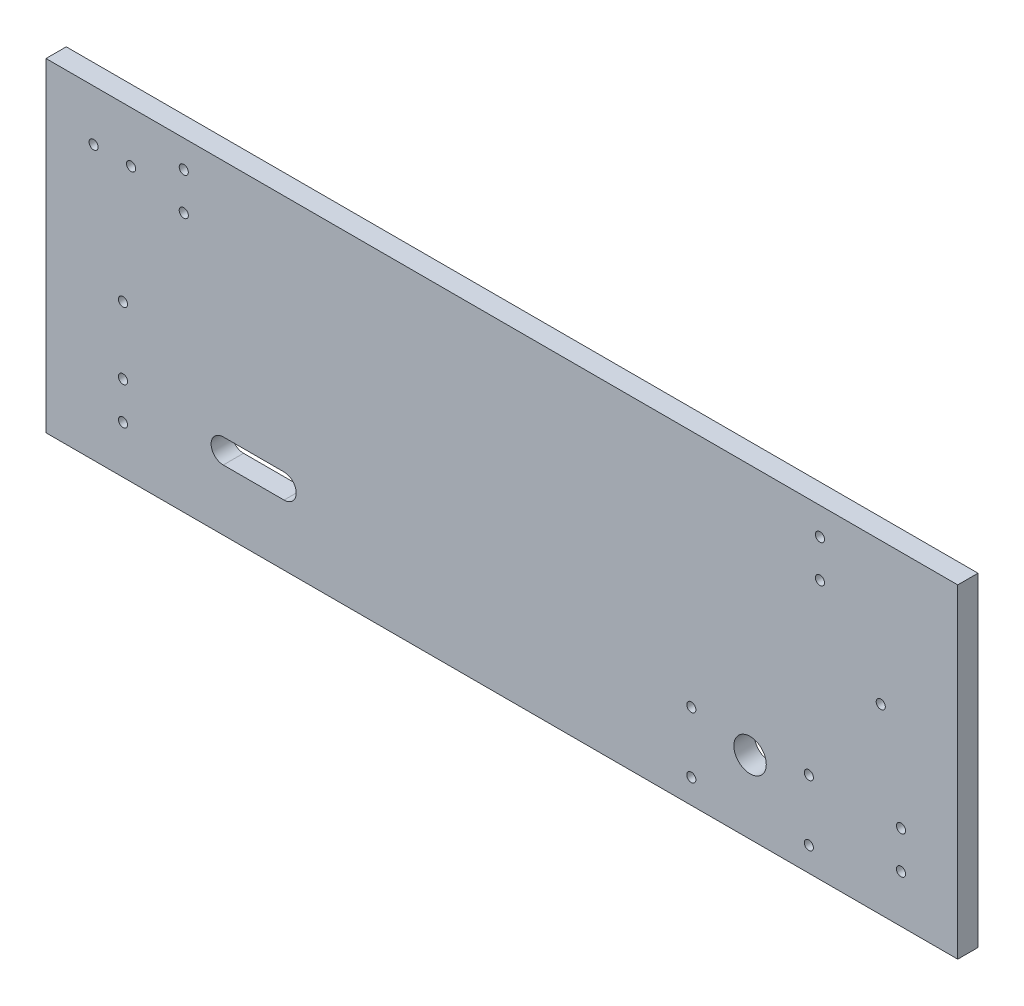
ISO-10303-21;
HEADER;
FILE_DESCRIPTION(('STEP AP214'),'2;1');
FILE_NAME('part.step','',(''),(''),'','','');
FILE_SCHEMA(('AUTOMOTIVE_DESIGN { 1 0 10303 214 1 1 1 1 }'));
ENDSEC;
DATA;
#1=APPLICATION_CONTEXT('core data for automotive mechanical design processes');
#2=APPLICATION_PROTOCOL_DEFINITION('international standard','automotive_design',2000,#1);
#3=PRODUCT_CONTEXT('',#1,'mechanical');
#4=PRODUCT('Part','Part','',(#3));
#5=PRODUCT_RELATED_PRODUCT_CATEGORY('part','',(#4));
#6=PRODUCT_DEFINITION_FORMATION('','',#4);
#7=PRODUCT_DEFINITION_CONTEXT('part definition',#1,'design');
#8=PRODUCT_DEFINITION('design','',#6,#7);
#9=PRODUCT_DEFINITION_SHAPE('','',#8);
#10=(LENGTH_UNIT() NAMED_UNIT(*) SI_UNIT(.MILLI.,.METRE.));
#11=(NAMED_UNIT(*) PLANE_ANGLE_UNIT() SI_UNIT($,.RADIAN.));
#12=(NAMED_UNIT(*) SI_UNIT($,.STERADIAN.) SOLID_ANGLE_UNIT());
#13=UNCERTAINTY_MEASURE_WITH_UNIT(LENGTH_MEASURE(1.E-05),#10,'distance_accuracy_value','');
#14=(GEOMETRIC_REPRESENTATION_CONTEXT(3) GLOBAL_UNCERTAINTY_ASSIGNED_CONTEXT((#13)) GLOBAL_UNIT_ASSIGNED_CONTEXT((#10,
#11,#12)) REPRESENTATION_CONTEXT('',''));
#15=CARTESIAN_POINT('',(0.,0.,0.));
#16=DIRECTION('',(0.,0.,1.));
#17=DIRECTION('',(1.,0.,0.));
#18=AXIS2_PLACEMENT_3D('',#15,#16,#17);
#19=CARTESIAN_POINT('',(0.,0.,10.));
#20=DIRECTION('',(1.,0.,0.));
#21=DIRECTION('',(0.,0.,-1.));
#22=AXIS2_PLACEMENT_3D('',#19,#20,#21);
#23=PLANE('',#22);
#24=DIRECTION('',(0.,-1.,0.));
#25=VECTOR('',#24,1.);
#26=CARTESIAN_POINT('',(0.,0.,0.));
#27=LINE('',#26,#25);
#28=CARTESIAN_POINT('',(0.,160.,0.));
#29=VERTEX_POINT('',#28);
#30=CARTESIAN_POINT('',(0.,0.,0.));
#31=VERTEX_POINT('',#30);
#32=EDGE_CURVE('E146',#29,#31,#27,.T.);
#33=ORIENTED_EDGE('',*,*,#32,.T.);
#34=DIRECTION('',(0.,0.,-1.));
#35=VECTOR('',#34,1.);
#36=CARTESIAN_POINT('',(0.,0.,10.));
#37=LINE('',#36,#35);
#38=CARTESIAN_POINT('',(0.,0.,10.));
#39=VERTEX_POINT('',#38);
#40=EDGE_CURVE('E11',#39,#31,#37,.T.);
#41=ORIENTED_EDGE('',*,*,#40,.F.);
#42=DIRECTION('',(0.,-1.,0.));
#43=VECTOR('',#42,1.);
#44=CARTESIAN_POINT('',(0.,0.,10.));
#45=LINE('',#44,#43);
#46=CARTESIAN_POINT('',(0.,160.,10.));
#47=VERTEX_POINT('',#46);
#48=EDGE_CURVE('E148',#47,#39,#45,.T.);
#49=ORIENTED_EDGE('',*,*,#48,.F.);
#50=DIRECTION('',(0.,0.,-1.));
#51=VECTOR('',#50,1.);
#52=CARTESIAN_POINT('',(0.,160.,10.));
#53=LINE('',#52,#51);
#54=EDGE_CURVE('E158',#47,#29,#53,.T.);
#55=ORIENTED_EDGE('',*,*,#54,.T.);
#56=EDGE_LOOP('',(#33,#41,#49,#55));
#57=FACE_BOUND('',#56,.T.);
#58=ADVANCED_FACE('F37',(#57),#23,.F.);
#59=CARTESIAN_POINT('',(0.,0.,10.));
#60=DIRECTION('',(0.,1.,0.));
#61=DIRECTION('',(0.,0.,1.));
#62=AXIS2_PLACEMENT_3D('',#59,#60,#61);
#63=PLANE('',#62);
#64=DIRECTION('',(1.,0.,0.));
#65=VECTOR('',#64,1.);
#66=CARTESIAN_POINT('',(0.,0.,0.));
#67=LINE('',#66,#65);
#68=CARTESIAN_POINT('',(450.,0.,0.));
#69=VERTEX_POINT('',#68);
#70=EDGE_CURVE('E161',#31,#69,#67,.T.);
#71=ORIENTED_EDGE('',*,*,#70,.T.);
#72=DIRECTION('',(0.,0.,-1.));
#73=VECTOR('',#72,1.);
#74=CARTESIAN_POINT('',(450.,0.,10.));
#75=LINE('',#74,#73);
#76=CARTESIAN_POINT('',(450.,0.,10.));
#77=VERTEX_POINT('',#76);
#78=EDGE_CURVE('E44',#77,#69,#75,.T.);
#79=ORIENTED_EDGE('',*,*,#78,.F.);
#80=DIRECTION('',(1.,0.,0.));
#81=VECTOR('',#80,1.);
#82=CARTESIAN_POINT('',(0.,0.,10.));
#83=LINE('',#82,#81);
#84=EDGE_CURVE('E151',#39,#77,#83,.T.);
#85=ORIENTED_EDGE('',*,*,#84,.F.);
#86=ORIENTED_EDGE('',*,*,#40,.T.);
#87=EDGE_LOOP('',(#71,#79,#85,#86));
#88=FACE_BOUND('',#87,.T.);
#89=ADVANCED_FACE('F190',(#88),#63,.F.);
#90=CARTESIAN_POINT('',(450.,0.,10.));
#91=DIRECTION('',(-1.,0.,0.));
#92=DIRECTION('',(0.,0.,1.));
#93=AXIS2_PLACEMENT_3D('',#90,#91,#92);
#94=PLANE('',#93);
#95=DIRECTION('',(0.,1.,0.));
#96=VECTOR('',#95,1.);
#97=CARTESIAN_POINT('',(450.,0.,0.));
#98=LINE('',#97,#96);
#99=CARTESIAN_POINT('',(450.,160.,0.));
#100=VERTEX_POINT('',#99);
#101=EDGE_CURVE('E163',#69,#100,#98,.T.);
#102=ORIENTED_EDGE('',*,*,#101,.T.);
#103=DIRECTION('',(0.,0.,-1.));
#104=VECTOR('',#103,1.);
#105=CARTESIAN_POINT('',(450.,160.,10.));
#106=LINE('',#105,#104);
#107=CARTESIAN_POINT('',(450.,160.,10.));
#108=VERTEX_POINT('',#107);
#109=EDGE_CURVE('E168',#108,#100,#106,.T.);
#110=ORIENTED_EDGE('',*,*,#109,.F.);
#111=DIRECTION('',(0.,1.,0.));
#112=VECTOR('',#111,1.);
#113=CARTESIAN_POINT('',(450.,0.,10.));
#114=LINE('',#113,#112);
#115=EDGE_CURVE('E154',#77,#108,#114,.T.);
#116=ORIENTED_EDGE('',*,*,#115,.F.);
#117=ORIENTED_EDGE('',*,*,#78,.T.);
#118=EDGE_LOOP('',(#102,#110,#116,#117));
#119=FACE_BOUND('',#118,.T.);
#120=ADVANCED_FACE('F175',(#119),#94,.F.);
#121=CARTESIAN_POINT('',(0.,160.,10.));
#122=DIRECTION('',(0.,-1.,0.));
#123=DIRECTION('',(0.,0.,-1.));
#124=AXIS2_PLACEMENT_3D('',#121,#122,#123);
#125=PLANE('',#124);
#126=DIRECTION('',(-1.,0.,0.));
#127=VECTOR('',#126,1.);
#128=CARTESIAN_POINT('',(0.,160.,0.));
#129=LINE('',#128,#127);
#130=EDGE_CURVE('E152',#100,#29,#129,.T.);
#131=ORIENTED_EDGE('',*,*,#130,.T.);
#132=ORIENTED_EDGE('',*,*,#54,.F.);
#133=DIRECTION('',(-1.,0.,0.));
#134=VECTOR('',#133,1.);
#135=CARTESIAN_POINT('',(0.,160.,10.));
#136=LINE('',#135,#134);
#137=EDGE_CURVE('E156',#108,#47,#136,.T.);
#138=ORIENTED_EDGE('',*,*,#137,.F.);
#139=ORIENTED_EDGE('',*,*,#109,.T.);
#140=EDGE_LOOP('',(#131,#132,#138,#139));
#141=FACE_BOUND('',#140,.T.);
#142=ADVANCED_FACE('F184',(#141),#125,.F.);
#143=CARTESIAN_POINT('',(0.,0.,10.));
#144=DIRECTION('',(0.,0.,-1.));
#145=DIRECTION('',(-1.,0.,0.));
#146=AXIS2_PLACEMENT_3D('',#143,#144,#145);
#147=PLANE('',#146);
#148=CARTESIAN_POINT('',(68.0000000000001,146.5,10.));
#149=DIRECTION('',(0.,0.,1.));
#150=DIRECTION('',(1.,0.,0.));
#151=AXIS2_PLACEMENT_3D('',#148,#149,#150);
#152=CIRCLE('',#151,2.25);
#153=CARTESIAN_POINT('',(70.2500000000001,146.5,10.));
#154=VERTEX_POINT('',#153);
#155=EDGE_CURVE('E329',#154,#154,#152,.T.);
#156=ORIENTED_EDGE('',*,*,#155,.F.);
#157=EDGE_LOOP('',(#156));
#158=FACE_BOUND('',#157,.T.);
#159=CARTESIAN_POINT('',(382.,128.,10.));
#160=DIRECTION('',(0.,0.,1.));
#161=DIRECTION('',(1.,0.,0.));
#162=AXIS2_PLACEMENT_3D('',#159,#160,#161);
#163=CIRCLE('',#162,2.24999999999996);
#164=CARTESIAN_POINT('',(384.25,128.,10.));
#165=VERTEX_POINT('',#164);
#166=EDGE_CURVE('E322',#165,#165,#163,.T.);
#167=ORIENTED_EDGE('',*,*,#166,.F.);
#168=EDGE_LOOP('',(#167));
#169=FACE_BOUND('',#168,.T.);
#170=CARTESIAN_POINT('',(382.,146.5,10.));
#171=DIRECTION('',(0.,0.,1.));
#172=DIRECTION('',(1.,0.,0.));
#173=AXIS2_PLACEMENT_3D('',#170,#171,#172);
#174=CIRCLE('',#173,2.24999999999996);
#175=CARTESIAN_POINT('',(384.25,146.5,10.));
#176=VERTEX_POINT('',#175);
#177=EDGE_CURVE('E341',#176,#176,#174,.T.);
#178=ORIENTED_EDGE('',*,*,#177,.F.);
#179=EDGE_LOOP('',(#178));
#180=FACE_BOUND('',#179,.T.);
#181=CARTESIAN_POINT('',(412.,89.9999999999999,10.));
#182=DIRECTION('',(0.,0.,1.));
#183=DIRECTION('',(1.,0.,0.));
#184=AXIS2_PLACEMENT_3D('',#181,#182,#183);
#185=CIRCLE('',#184,2.24999999999995);
#186=CARTESIAN_POINT('',(414.25,89.9999999999999,10.));
#187=VERTEX_POINT('',#186);
#188=EDGE_CURVE('E334',#187,#187,#185,.T.);
#189=ORIENTED_EDGE('',*,*,#188,.F.);
#190=EDGE_LOOP('',(#189));
#191=FACE_BOUND('',#190,.T.);
#192=CARTESIAN_POINT('',(68.0000000000001,128.,10.));
#193=DIRECTION('',(0.,0.,1.));
#194=DIRECTION('',(1.,0.,0.));
#195=AXIS2_PLACEMENT_3D('',#192,#193,#194);
#196=CIRCLE('',#195,2.25);
#197=CARTESIAN_POINT('',(70.2500000000001,128.,10.));
#198=VERTEX_POINT('',#197);
#199=EDGE_CURVE('E301',#198,#198,#196,.T.);
#200=ORIENTED_EDGE('',*,*,#199,.F.);
#201=EDGE_LOOP('',(#200));
#202=FACE_BOUND('',#201,.T.);
#203=CARTESIAN_POINT('',(38.,42.,10.));
#204=DIRECTION('',(0.,0.,1.));
#205=DIRECTION('',(1.,0.,0.));
#206=AXIS2_PLACEMENT_3D('',#203,#204,#205);
#207=CIRCLE('',#206,2.25);
#208=CARTESIAN_POINT('',(40.25,42.,10.));
#209=VERTEX_POINT('',#208);
#210=EDGE_CURVE('E308',#209,#209,#207,.T.);
#211=ORIENTED_EDGE('',*,*,#210,.F.);
#212=EDGE_LOOP('',(#211));
#213=FACE_BOUND('',#212,.T.);
#214=CARTESIAN_POINT('',(38.,23.5,10.));
#215=DIRECTION('',(0.,0.,1.));
#216=DIRECTION('',(1.,0.,0.));
#217=AXIS2_PLACEMENT_3D('',#214,#215,#216);
#218=CIRCLE('',#217,2.25);
#219=CARTESIAN_POINT('',(40.25,23.5,10.));
#220=VERTEX_POINT('',#219);
#221=EDGE_CURVE('E314',#220,#220,#218,.T.);
#222=ORIENTED_EDGE('',*,*,#221,.F.);
#223=EDGE_LOOP('',(#222));
#224=FACE_BOUND('',#223,.T.);
#225=CARTESIAN_POINT('',(422.,23.4999999999999,10.));
#226=DIRECTION('',(0.,0.,1.));
#227=DIRECTION('',(1.,0.,0.));
#228=AXIS2_PLACEMENT_3D('',#225,#226,#227);
#229=CIRCLE('',#228,2.24999999999995);
#230=CARTESIAN_POINT('',(424.25,23.4999999999999,10.));
#231=VERTEX_POINT('',#230);
#232=EDGE_CURVE('E297',#231,#231,#229,.T.);
#233=ORIENTED_EDGE('',*,*,#232,.F.);
#234=EDGE_LOOP('',(#233));
#235=FACE_BOUND('',#234,.T.);
#236=CARTESIAN_POINT('',(318.5,12.,10.));
#237=DIRECTION('',(0.,0.,1.));
#238=DIRECTION('',(1.,0.,0.));
#239=AXIS2_PLACEMENT_3D('',#236,#237,#238);
#240=CIRCLE('',#239,2.24999999999995);
#241=CARTESIAN_POINT('',(320.75,12.,10.));
#242=VERTEX_POINT('',#241);
#243=EDGE_CURVE('E375',#242,#242,#240,.T.);
#244=ORIENTED_EDGE('',*,*,#243,.F.);
#245=EDGE_LOOP('',(#244));
#246=FACE_BOUND('',#245,.T.);
#247=CARTESIAN_POINT('',(318.5,42.,10.));
#248=DIRECTION('',(0.,0.,1.));
#249=DIRECTION('',(1.,0.,0.));
#250=AXIS2_PLACEMENT_3D('',#247,#248,#249);
#251=CIRCLE('',#250,2.24999999999995);
#252=CARTESIAN_POINT('',(320.75,42.,10.));
#253=VERTEX_POINT('',#252);
#254=EDGE_CURVE('E144',#253,#253,#251,.T.);
#255=ORIENTED_EDGE('',*,*,#254,.F.);
#256=EDGE_LOOP('',(#255));
#257=FACE_BOUND('',#256,.T.);
#258=CARTESIAN_POINT('',(376.5,42.,10.));
#259=DIRECTION('',(0.,0.,1.));
#260=DIRECTION('',(1.,0.,0.));
#261=AXIS2_PLACEMENT_3D('',#258,#259,#260);
#262=CIRCLE('',#261,2.24999999999995);
#263=CARTESIAN_POINT('',(378.75,42.,10.));
#264=VERTEX_POINT('',#263);
#265=EDGE_CURVE('E108',#264,#264,#262,.T.);
#266=ORIENTED_EDGE('',*,*,#265,.F.);
#267=EDGE_LOOP('',(#266));
#268=FACE_BOUND('',#267,.T.);
#269=DIRECTION('',(1.,0.,0.));
#270=VECTOR('',#269,1.);
#271=CARTESIAN_POINT('',(87.5,30.,10.));
#272=LINE('',#271,#270);
#273=CARTESIAN_POINT('',(87.5,30.,10.));
#274=VERTEX_POINT('',#273);
#275=CARTESIAN_POINT('',(117.5,30.,10.));
#276=VERTEX_POINT('',#275);
#277=EDGE_CURVE('E122',#274,#276,#272,.T.);
#278=ORIENTED_EDGE('',*,*,#277,.F.);
#279=CARTESIAN_POINT('',(87.5,36.,10.));
#280=DIRECTION('',(0.,0.,1.));
#281=DIRECTION('',(1.,0.,0.));
#282=AXIS2_PLACEMENT_3D('',#279,#280,#281);
#283=CIRCLE('',#282,6.);
#284=CARTESIAN_POINT('',(87.5,42.,10.));
#285=VERTEX_POINT('',#284);
#286=EDGE_CURVE('E51',#285,#274,#283,.T.);
#287=ORIENTED_EDGE('',*,*,#286,.F.);
#288=DIRECTION('',(-1.,0.,0.));
#289=VECTOR('',#288,1.);
#290=CARTESIAN_POINT('',(87.5,42.,10.));
#291=LINE('',#290,#289);
#292=CARTESIAN_POINT('',(117.5,42.,10.));
#293=VERTEX_POINT('',#292);
#294=EDGE_CURVE('E111',#293,#285,#291,.T.);
#295=ORIENTED_EDGE('',*,*,#294,.F.);
#296=CARTESIAN_POINT('',(117.5,36.,10.));
#297=DIRECTION('',(0.,0.,1.));
#298=DIRECTION('',(1.,0.,0.));
#299=AXIS2_PLACEMENT_3D('',#296,#297,#298);
#300=CIRCLE('',#299,6.);
#301=EDGE_CURVE('E116',#276,#293,#300,.T.);
#302=ORIENTED_EDGE('',*,*,#301,.F.);
#303=EDGE_LOOP('',(#278,#287,#295,#302));
#304=FACE_BOUND('',#303,.T.);
#305=CARTESIAN_POINT('',(38.,75.,10.));
#306=DIRECTION('',(0.,0.,1.));
#307=DIRECTION('',(1.,0.,0.));
#308=AXIS2_PLACEMENT_3D('',#305,#306,#307);
#309=CIRCLE('',#308,2.25);
#310=CARTESIAN_POINT('',(40.25,75.,10.));
#311=VERTEX_POINT('',#310);
#312=EDGE_CURVE('E353',#311,#311,#309,.T.);
#313=ORIENTED_EDGE('',*,*,#312,.F.);
#314=EDGE_LOOP('',(#313));
#315=FACE_BOUND('',#314,.T.);
#316=CARTESIAN_POINT('',(42.,134.933694221876,10.));
#317=DIRECTION('',(0.,0.,1.));
#318=DIRECTION('',(1.,0.,0.));
#319=AXIS2_PLACEMENT_3D('',#316,#317,#318);
#320=CIRCLE('',#319,2.25);
#321=CARTESIAN_POINT('',(44.25,134.933694221876,10.));
#322=VERTEX_POINT('',#321);
#323=EDGE_CURVE('E346',#322,#322,#320,.T.);
#324=ORIENTED_EDGE('',*,*,#323,.F.);
#325=EDGE_LOOP('',(#324));
#326=FACE_BOUND('',#325,.T.);
#327=CARTESIAN_POINT('',(23.5,134.933694221876,10.));
#328=DIRECTION('',(0.,0.,1.));
#329=DIRECTION('',(1.,0.,0.));
#330=AXIS2_PLACEMENT_3D('',#327,#328,#329);
#331=CIRCLE('',#330,2.25);
#332=CARTESIAN_POINT('',(25.75,134.933694221876,10.));
#333=VERTEX_POINT('',#332);
#334=EDGE_CURVE('E365',#333,#333,#331,.T.);
#335=ORIENTED_EDGE('',*,*,#334,.F.);
#336=EDGE_LOOP('',(#335));
#337=FACE_BOUND('',#336,.T.);
#338=CARTESIAN_POINT('',(376.5,12.,10.));
#339=DIRECTION('',(0.,0.,1.));
#340=DIRECTION('',(1.,0.,0.));
#341=AXIS2_PLACEMENT_3D('',#338,#339,#340);
#342=CIRCLE('',#341,2.25000000000001);
#343=CARTESIAN_POINT('',(378.75,12.,10.));
#344=VERTEX_POINT('',#343);
#345=EDGE_CURVE('E358',#344,#344,#342,.T.);
#346=ORIENTED_EDGE('',*,*,#345,.F.);
#347=EDGE_LOOP('',(#346));
#348=FACE_BOUND('',#347,.T.);
#349=CARTESIAN_POINT('',(422.,41.9999999999999,10.));
#350=DIRECTION('',(0.,0.,1.));
#351=DIRECTION('',(1.,0.,0.));
#352=AXIS2_PLACEMENT_3D('',#349,#350,#351);
#353=CIRCLE('',#352,2.24999999999995);
#354=CARTESIAN_POINT('',(424.25,41.9999999999999,10.));
#355=VERTEX_POINT('',#354);
#356=EDGE_CURVE('E292',#355,#355,#353,.T.);
#357=ORIENTED_EDGE('',*,*,#356,.F.);
#358=EDGE_LOOP('',(#357));
#359=FACE_BOUND('',#358,.T.);
#360=CARTESIAN_POINT('',(347.5,36.,10.));
#361=DIRECTION('',(0.,0.,1.));
#362=DIRECTION('',(1.,0.,0.));
#363=AXIS2_PLACEMENT_3D('',#360,#361,#362);
#364=CIRCLE('',#363,7.99999999999998);
#365=CARTESIAN_POINT('',(355.5,36.,10.));
#366=VERTEX_POINT('',#365);
#367=EDGE_CURVE('E123',#366,#366,#364,.T.);
#368=ORIENTED_EDGE('',*,*,#367,.F.);
#369=EDGE_LOOP('',(#368));
#370=FACE_BOUND('',#369,.T.);
#371=ORIENTED_EDGE('',*,*,#48,.T.);
#372=ORIENTED_EDGE('',*,*,#84,.T.);
#373=ORIENTED_EDGE('',*,*,#115,.T.);
#374=ORIENTED_EDGE('',*,*,#137,.T.);
#375=EDGE_LOOP('',(#371,#372,#373,#374));
#376=FACE_BOUND('',#375,.T.);
#377=ADVANCED_FACE('F119',(#158,#169,#180,#191,#202,#213,#224,#235,#246,#257,#268,#304,#315,
#326,#337,#348,#359,#370,#376),#147,.F.);
#378=CARTESIAN_POINT('',(0.,0.,0.));
#379=DIRECTION('',(0.,0.,-1.));
#380=DIRECTION('',(-1.,0.,0.));
#381=AXIS2_PLACEMENT_3D('',#378,#379,#380);
#382=PLANE('',#381);
#383=CARTESIAN_POINT('',(68.0000000000001,146.5,0.));
#384=DIRECTION('',(0.,0.,1.));
#385=DIRECTION('',(1.,0.,0.));
#386=AXIS2_PLACEMENT_3D('',#383,#384,#385);
#387=CIRCLE('',#386,2.25);
#388=CARTESIAN_POINT('',(70.2500000000001,146.5,0.));
#389=VERTEX_POINT('',#388);
#390=EDGE_CURVE('E304',#389,#389,#387,.T.);
#391=ORIENTED_EDGE('',*,*,#390,.T.);
#392=EDGE_LOOP('',(#391));
#393=FACE_BOUND('',#392,.T.);
#394=CARTESIAN_POINT('',(382.,128.,0.));
#395=DIRECTION('',(0.,0.,1.));
#396=DIRECTION('',(1.,0.,0.));
#397=AXIS2_PLACEMENT_3D('',#394,#395,#396);
#398=CIRCLE('',#397,2.24999999999996);
#399=CARTESIAN_POINT('',(384.25,128.,0.));
#400=VERTEX_POINT('',#399);
#401=EDGE_CURVE('E326',#400,#400,#398,.T.);
#402=ORIENTED_EDGE('',*,*,#401,.T.);
#403=EDGE_LOOP('',(#402));
#404=FACE_BOUND('',#403,.T.);
#405=CARTESIAN_POINT('',(382.,146.5,0.));
#406=DIRECTION('',(0.,0.,1.));
#407=DIRECTION('',(1.,0.,0.));
#408=AXIS2_PLACEMENT_3D('',#405,#406,#407);
#409=CIRCLE('',#408,2.24999999999996);
#410=CARTESIAN_POINT('',(384.25,146.5,0.));
#411=VERTEX_POINT('',#410);
#412=EDGE_CURVE('E325',#411,#411,#409,.T.);
#413=ORIENTED_EDGE('',*,*,#412,.T.);
#414=EDGE_LOOP('',(#413));
#415=FACE_BOUND('',#414,.T.);
#416=CARTESIAN_POINT('',(412.,89.9999999999999,0.));
#417=DIRECTION('',(0.,0.,1.));
#418=DIRECTION('',(1.,0.,0.));
#419=AXIS2_PLACEMENT_3D('',#416,#417,#418);
#420=CIRCLE('',#419,2.24999999999995);
#421=CARTESIAN_POINT('',(414.25,89.9999999999999,0.));
#422=VERTEX_POINT('',#421);
#423=EDGE_CURVE('E338',#422,#422,#420,.T.);
#424=ORIENTED_EDGE('',*,*,#423,.T.);
#425=EDGE_LOOP('',(#424));
#426=FACE_BOUND('',#425,.T.);
#427=CARTESIAN_POINT('',(68.0000000000001,128.,0.));
#428=DIRECTION('',(0.,0.,1.));
#429=DIRECTION('',(1.,0.,0.));
#430=AXIS2_PLACEMENT_3D('',#427,#428,#429);
#431=CIRCLE('',#430,2.25);
#432=CARTESIAN_POINT('',(70.2500000000001,128.,0.));
#433=VERTEX_POINT('',#432);
#434=EDGE_CURVE('E305',#433,#433,#431,.T.);
#435=ORIENTED_EDGE('',*,*,#434,.T.);
#436=EDGE_LOOP('',(#435));
#437=FACE_BOUND('',#436,.T.);
#438=CARTESIAN_POINT('',(38.,42.,0.));
#439=DIRECTION('',(0.,0.,1.));
#440=DIRECTION('',(1.,0.,0.));
#441=AXIS2_PLACEMENT_3D('',#438,#439,#440);
#442=CIRCLE('',#441,2.25);
#443=CARTESIAN_POINT('',(40.25,42.,0.));
#444=VERTEX_POINT('',#443);
#445=EDGE_CURVE('E311',#444,#444,#442,.T.);
#446=ORIENTED_EDGE('',*,*,#445,.T.);
#447=EDGE_LOOP('',(#446));
#448=FACE_BOUND('',#447,.T.);
#449=CARTESIAN_POINT('',(38.,23.5,0.));
#450=DIRECTION('',(0.,0.,1.));
#451=DIRECTION('',(1.,0.,0.));
#452=AXIS2_PLACEMENT_3D('',#449,#450,#451);
#453=CIRCLE('',#452,2.25);
#454=CARTESIAN_POINT('',(40.25,23.5,0.));
#455=VERTEX_POINT('',#454);
#456=EDGE_CURVE('E317',#455,#455,#453,.T.);
#457=ORIENTED_EDGE('',*,*,#456,.T.);
#458=EDGE_LOOP('',(#457));
#459=FACE_BOUND('',#458,.T.);
#460=CARTESIAN_POINT('',(422.,23.4999999999999,0.));
#461=DIRECTION('',(0.,0.,1.));
#462=DIRECTION('',(1.,0.,0.));
#463=AXIS2_PLACEMENT_3D('',#460,#461,#462);
#464=CIRCLE('',#463,2.24999999999995);
#465=CARTESIAN_POINT('',(424.25,23.4999999999999,0.));
#466=VERTEX_POINT('',#465);
#467=EDGE_CURVE('E294',#466,#466,#464,.T.);
#468=ORIENTED_EDGE('',*,*,#467,.T.);
#469=EDGE_LOOP('',(#468));
#470=FACE_BOUND('',#469,.T.);
#471=CARTESIAN_POINT('',(318.5,12.,0.));
#472=DIRECTION('',(0.,0.,1.));
#473=DIRECTION('',(1.,0.,0.));
#474=AXIS2_PLACEMENT_3D('',#471,#472,#473);
#475=CIRCLE('',#474,2.24999999999995);
#476=CARTESIAN_POINT('',(320.75,12.,0.));
#477=VERTEX_POINT('',#476);
#478=EDGE_CURVE('E361',#477,#477,#475,.T.);
#479=ORIENTED_EDGE('',*,*,#478,.T.);
#480=EDGE_LOOP('',(#479));
#481=FACE_BOUND('',#480,.T.);
#482=CARTESIAN_POINT('',(318.5,42.,0.));
#483=DIRECTION('',(0.,0.,1.));
#484=DIRECTION('',(1.,0.,0.));
#485=AXIS2_PLACEMENT_3D('',#482,#483,#484);
#486=CIRCLE('',#485,2.24999999999995);
#487=CARTESIAN_POINT('',(320.75,42.,0.));
#488=VERTEX_POINT('',#487);
#489=EDGE_CURVE('E372',#488,#488,#486,.T.);
#490=ORIENTED_EDGE('',*,*,#489,.T.);
#491=EDGE_LOOP('',(#490));
#492=FACE_BOUND('',#491,.T.);
#493=CARTESIAN_POINT('',(376.5,42.,0.));
#494=DIRECTION('',(0.,0.,1.));
#495=DIRECTION('',(1.,0.,0.));
#496=AXIS2_PLACEMENT_3D('',#493,#494,#495);
#497=CIRCLE('',#496,2.24999999999995);
#498=CARTESIAN_POINT('',(378.75,42.,0.));
#499=VERTEX_POINT('',#498);
#500=EDGE_CURVE('E141',#499,#499,#497,.T.);
#501=ORIENTED_EDGE('',*,*,#500,.T.);
#502=EDGE_LOOP('',(#501));
#503=FACE_BOUND('',#502,.T.);
#504=CARTESIAN_POINT('',(87.5,36.,0.));
#505=DIRECTION('',(0.,0.,1.));
#506=DIRECTION('',(1.,0.,0.));
#507=AXIS2_PLACEMENT_3D('',#504,#505,#506);
#508=CIRCLE('',#507,6.);
#509=CARTESIAN_POINT('',(87.5,42.,0.));
#510=VERTEX_POINT('',#509);
#511=CARTESIAN_POINT('',(87.5,30.,0.));
#512=VERTEX_POINT('',#511);
#513=EDGE_CURVE('E103',#510,#512,#508,.T.);
#514=ORIENTED_EDGE('',*,*,#513,.T.);
#515=DIRECTION('',(1.,0.,0.));
#516=VECTOR('',#515,1.);
#517=CARTESIAN_POINT('',(87.5,30.,0.));
#518=LINE('',#517,#516);
#519=CARTESIAN_POINT('',(117.5,30.,0.));
#520=VERTEX_POINT('',#519);
#521=EDGE_CURVE('E135',#512,#520,#518,.T.);
#522=ORIENTED_EDGE('',*,*,#521,.T.);
#523=CARTESIAN_POINT('',(117.5,36.,0.));
#524=DIRECTION('',(0.,0.,1.));
#525=DIRECTION('',(1.,0.,0.));
#526=AXIS2_PLACEMENT_3D('',#523,#524,#525);
#527=CIRCLE('',#526,6.);
#528=CARTESIAN_POINT('',(117.5,42.,0.));
#529=VERTEX_POINT('',#528);
#530=EDGE_CURVE('E59',#520,#529,#527,.T.);
#531=ORIENTED_EDGE('',*,*,#530,.T.);
#532=DIRECTION('',(-1.,0.,0.));
#533=VECTOR('',#532,1.);
#534=CARTESIAN_POINT('',(87.5,42.,0.));
#535=LINE('',#534,#533);
#536=EDGE_CURVE('E131',#529,#510,#535,.T.);
#537=ORIENTED_EDGE('',*,*,#536,.T.);
#538=EDGE_LOOP('',(#514,#522,#531,#537));
#539=FACE_BOUND('',#538,.T.);
#540=CARTESIAN_POINT('',(38.,75.,0.));
#541=DIRECTION('',(0.,0.,1.));
#542=DIRECTION('',(1.,0.,0.));
#543=AXIS2_PLACEMENT_3D('',#540,#541,#542);
#544=CIRCLE('',#543,2.25);
#545=CARTESIAN_POINT('',(40.25,75.,0.));
#546=VERTEX_POINT('',#545);
#547=EDGE_CURVE('E337',#546,#546,#544,.T.);
#548=ORIENTED_EDGE('',*,*,#547,.T.);
#549=EDGE_LOOP('',(#548));
#550=FACE_BOUND('',#549,.T.);
#551=CARTESIAN_POINT('',(42.,134.933694221876,0.));
#552=DIRECTION('',(0.,0.,1.));
#553=DIRECTION('',(1.,0.,0.));
#554=AXIS2_PLACEMENT_3D('',#551,#552,#553);
#555=CIRCLE('',#554,2.25);
#556=CARTESIAN_POINT('',(44.25,134.933694221876,0.));
#557=VERTEX_POINT('',#556);
#558=EDGE_CURVE('E350',#557,#557,#555,.T.);
#559=ORIENTED_EDGE('',*,*,#558,.T.);
#560=EDGE_LOOP('',(#559));
#561=FACE_BOUND('',#560,.T.);
#562=CARTESIAN_POINT('',(23.5,134.933694221876,0.));
#563=DIRECTION('',(0.,0.,1.));
#564=DIRECTION('',(1.,0.,0.));
#565=AXIS2_PLACEMENT_3D('',#562,#563,#564);
#566=CIRCLE('',#565,2.25);
#567=CARTESIAN_POINT('',(25.75,134.933694221876,0.));
#568=VERTEX_POINT('',#567);
#569=EDGE_CURVE('E349',#568,#568,#566,.T.);
#570=ORIENTED_EDGE('',*,*,#569,.T.);
#571=EDGE_LOOP('',(#570));
#572=FACE_BOUND('',#571,.T.);
#573=CARTESIAN_POINT('',(376.5,12.,0.));
#574=DIRECTION('',(0.,0.,1.));
#575=DIRECTION('',(1.,0.,0.));
#576=AXIS2_PLACEMENT_3D('',#573,#574,#575);
#577=CIRCLE('',#576,2.25000000000001);
#578=CARTESIAN_POINT('',(378.75,12.,0.));
#579=VERTEX_POINT('',#578);
#580=EDGE_CURVE('E362',#579,#579,#577,.T.);
#581=ORIENTED_EDGE('',*,*,#580,.T.);
#582=EDGE_LOOP('',(#581));
#583=FACE_BOUND('',#582,.T.);
#584=CARTESIAN_POINT('',(422.,41.9999999999999,0.));
#585=DIRECTION('',(0.,0.,1.));
#586=DIRECTION('',(1.,0.,0.));
#587=AXIS2_PLACEMENT_3D('',#584,#585,#586);
#588=CIRCLE('',#587,2.24999999999995);
#589=CARTESIAN_POINT('',(424.25,41.9999999999999,0.));
#590=VERTEX_POINT('',#589);
#591=EDGE_CURVE('E289',#590,#590,#588,.T.);
#592=ORIENTED_EDGE('',*,*,#591,.T.);
#593=EDGE_LOOP('',(#592));
#594=FACE_BOUND('',#593,.T.);
#595=CARTESIAN_POINT('',(347.5,36.,0.));
#596=DIRECTION('',(0.,0.,1.));
#597=DIRECTION('',(1.,0.,0.));
#598=AXIS2_PLACEMENT_3D('',#595,#596,#597);
#599=CIRCLE('',#598,7.99999999999998);
#600=CARTESIAN_POINT('',(355.5,36.,0.));
#601=VERTEX_POINT('',#600);
#602=EDGE_CURVE('E126',#601,#601,#599,.T.);
#603=ORIENTED_EDGE('',*,*,#602,.T.);
#604=EDGE_LOOP('',(#603));
#605=FACE_BOUND('',#604,.T.);
#606=ORIENTED_EDGE('',*,*,#32,.F.);
#607=ORIENTED_EDGE('',*,*,#130,.F.);
#608=ORIENTED_EDGE('',*,*,#101,.F.);
#609=ORIENTED_EDGE('',*,*,#70,.F.);
#610=EDGE_LOOP('',(#606,#607,#608,#609));
#611=FACE_BOUND('',#610,.T.);
#612=ADVANCED_FACE('F181',(#393,#404,#415,#426,#437,#448,#459,#470,#481,#492,#503,#539,#550,
#561,#572,#583,#594,#605,#611),#382,.T.);
#613=CARTESIAN_POINT('',(347.5,36.,0.));
#614=DIRECTION('',(0.,0.,1.));
#615=DIRECTION('',(1.,0.,0.));
#616=AXIS2_PLACEMENT_3D('',#613,#614,#615);
#617=CYLINDRICAL_SURFACE('',#616,7.99999999999998);
#618=ORIENTED_EDGE('',*,*,#602,.F.);
#619=EDGE_LOOP('',(#618));
#620=FACE_BOUND('',#619,.T.);
#621=ORIENTED_EDGE('',*,*,#367,.T.);
#622=EDGE_LOOP('',(#621));
#623=FACE_BOUND('',#622,.T.);
#624=ADVANCED_FACE('F202',(#620,#623),#617,.F.);
#625=CARTESIAN_POINT('',(422.,41.9999999999999,0.));
#626=DIRECTION('',(0.,0.,1.));
#627=DIRECTION('',(1.,0.,0.));
#628=AXIS2_PLACEMENT_3D('',#625,#626,#627);
#629=CYLINDRICAL_SURFACE('',#628,2.24999999999995);
#630=ORIENTED_EDGE('',*,*,#591,.F.);
#631=EDGE_LOOP('',(#630));
#632=FACE_BOUND('',#631,.T.);
#633=ORIENTED_EDGE('',*,*,#356,.T.);
#634=EDGE_LOOP('',(#633));
#635=FACE_BOUND('',#634,.T.);
#636=ADVANCED_FACE('F209',(#632,#635),#629,.F.);
#637=CARTESIAN_POINT('',(376.5,12.,0.));
#638=DIRECTION('',(0.,0.,1.));
#639=DIRECTION('',(1.,0.,0.));
#640=AXIS2_PLACEMENT_3D('',#637,#638,#639);
#641=CYLINDRICAL_SURFACE('',#640,2.25000000000001);
#642=ORIENTED_EDGE('',*,*,#580,.F.);
#643=EDGE_LOOP('',(#642));
#644=FACE_BOUND('',#643,.T.);
#645=ORIENTED_EDGE('',*,*,#345,.T.);
#646=EDGE_LOOP('',(#645));
#647=FACE_BOUND('',#646,.T.);
#648=ADVANCED_FACE('F240',(#644,#647),#641,.F.);
#649=CARTESIAN_POINT('',(23.5,134.933694221876,0.));
#650=DIRECTION('',(0.,0.,1.));
#651=DIRECTION('',(1.,0.,0.));
#652=AXIS2_PLACEMENT_3D('',#649,#650,#651);
#653=CYLINDRICAL_SURFACE('',#652,2.25);
#654=ORIENTED_EDGE('',*,*,#569,.F.);
#655=EDGE_LOOP('',(#654));
#656=FACE_BOUND('',#655,.T.);
#657=ORIENTED_EDGE('',*,*,#334,.T.);
#658=EDGE_LOOP('',(#657));
#659=FACE_BOUND('',#658,.T.);
#660=ADVANCED_FACE('F236',(#656,#659),#653,.F.);
#661=CARTESIAN_POINT('',(42.,134.933694221876,0.));
#662=DIRECTION('',(0.,0.,1.));
#663=DIRECTION('',(1.,0.,0.));
#664=AXIS2_PLACEMENT_3D('',#661,#662,#663);
#665=CYLINDRICAL_SURFACE('',#664,2.25);
#666=ORIENTED_EDGE('',*,*,#558,.F.);
#667=EDGE_LOOP('',(#666));
#668=FACE_BOUND('',#667,.T.);
#669=ORIENTED_EDGE('',*,*,#323,.T.);
#670=EDGE_LOOP('',(#669));
#671=FACE_BOUND('',#670,.T.);
#672=ADVANCED_FACE('F239',(#668,#671),#665,.F.);
#673=CARTESIAN_POINT('',(38.,75.,0.));
#674=DIRECTION('',(0.,0.,1.));
#675=DIRECTION('',(1.,0.,0.));
#676=AXIS2_PLACEMENT_3D('',#673,#674,#675);
#677=CYLINDRICAL_SURFACE('',#676,2.25);
#678=ORIENTED_EDGE('',*,*,#547,.F.);
#679=EDGE_LOOP('',(#678));
#680=FACE_BOUND('',#679,.T.);
#681=ORIENTED_EDGE('',*,*,#312,.T.);
#682=EDGE_LOOP('',(#681));
#683=FACE_BOUND('',#682,.T.);
#684=ADVANCED_FACE('F227',(#680,#683),#677,.F.);
#685=CARTESIAN_POINT('',(87.5,36.,0.));
#686=DIRECTION('',(0.,0.,1.));
#687=DIRECTION('',(1.,0.,0.));
#688=AXIS2_PLACEMENT_3D('',#685,#686,#687);
#689=CYLINDRICAL_SURFACE('',#688,6.);
#690=ORIENTED_EDGE('',*,*,#286,.T.);
#691=DIRECTION('',(0.,0.,1.));
#692=VECTOR('',#691,1.);
#693=CARTESIAN_POINT('',(87.5,30.,0.));
#694=LINE('',#693,#692);
#695=EDGE_CURVE('E133',#512,#274,#694,.T.);
#696=ORIENTED_EDGE('',*,*,#695,.F.);
#697=ORIENTED_EDGE('',*,*,#513,.F.);
#698=DIRECTION('',(0.,0.,1.));
#699=VECTOR('',#698,1.);
#700=CARTESIAN_POINT('',(87.5,42.,0.));
#701=LINE('',#700,#699);
#702=EDGE_CURVE('E99',#510,#285,#701,.T.);
#703=ORIENTED_EDGE('',*,*,#702,.T.);
#704=EDGE_LOOP('',(#690,#696,#697,#703));
#705=FACE_BOUND('',#704,.T.);
#706=ADVANCED_FACE('F101',(#705),#689,.F.);
#707=CARTESIAN_POINT('',(87.5,42.,0.));
#708=DIRECTION('',(0.,1.,0.));
#709=DIRECTION('',(-1.,0.,0.));
#710=AXIS2_PLACEMENT_3D('',#707,#708,#709);
#711=PLANE('',#710);
#712=ORIENTED_EDGE('',*,*,#294,.T.);
#713=ORIENTED_EDGE('',*,*,#702,.F.);
#714=ORIENTED_EDGE('',*,*,#536,.F.);
#715=DIRECTION('',(0.,0.,1.));
#716=VECTOR('',#715,1.);
#717=CARTESIAN_POINT('',(117.5,42.,0.));
#718=LINE('',#717,#716);
#719=EDGE_CURVE('E107',#529,#293,#718,.T.);
#720=ORIENTED_EDGE('',*,*,#719,.T.);
#721=EDGE_LOOP('',(#712,#713,#714,#720));
#722=FACE_BOUND('',#721,.T.);
#723=ADVANCED_FACE('F112',(#722),#711,.F.);
#724=CARTESIAN_POINT('',(117.5,36.,0.));
#725=DIRECTION('',(0.,0.,1.));
#726=DIRECTION('',(1.,0.,0.));
#727=AXIS2_PLACEMENT_3D('',#724,#725,#726);
#728=CYLINDRICAL_SURFACE('',#727,6.);
#729=ORIENTED_EDGE('',*,*,#301,.T.);
#730=ORIENTED_EDGE('',*,*,#719,.F.);
#731=ORIENTED_EDGE('',*,*,#530,.F.);
#732=DIRECTION('',(0.,0.,1.));
#733=VECTOR('',#732,1.);
#734=CARTESIAN_POINT('',(117.5,30.,0.));
#735=LINE('',#734,#733);
#736=EDGE_CURVE('E381',#520,#276,#735,.T.);
#737=ORIENTED_EDGE('',*,*,#736,.T.);
#738=EDGE_LOOP('',(#729,#730,#731,#737));
#739=FACE_BOUND('',#738,.T.);
#740=ADVANCED_FACE('F219',(#739),#728,.F.);
#741=CARTESIAN_POINT('',(87.5,30.,0.));
#742=DIRECTION('',(0.,-1.,0.));
#743=DIRECTION('',(1.,0.,0.));
#744=AXIS2_PLACEMENT_3D('',#741,#742,#743);
#745=PLANE('',#744);
#746=ORIENTED_EDGE('',*,*,#277,.T.);
#747=ORIENTED_EDGE('',*,*,#736,.F.);
#748=ORIENTED_EDGE('',*,*,#521,.F.);
#749=ORIENTED_EDGE('',*,*,#695,.T.);
#750=EDGE_LOOP('',(#746,#747,#748,#749));
#751=FACE_BOUND('',#750,.T.);
#752=ADVANCED_FACE('F215',(#751),#745,.F.);
#753=CARTESIAN_POINT('',(376.5,42.,0.));
#754=DIRECTION('',(0.,0.,1.));
#755=DIRECTION('',(1.,0.,0.));
#756=AXIS2_PLACEMENT_3D('',#753,#754,#755);
#757=CYLINDRICAL_SURFACE('',#756,2.24999999999995);
#758=ORIENTED_EDGE('',*,*,#500,.F.);
#759=EDGE_LOOP('',(#758));
#760=FACE_BOUND('',#759,.T.);
#761=ORIENTED_EDGE('',*,*,#265,.T.);
#762=EDGE_LOOP('',(#761));
#763=FACE_BOUND('',#762,.T.);
#764=ADVANCED_FACE('F211',(#760,#763),#757,.F.);
#765=CARTESIAN_POINT('',(318.5,42.,0.));
#766=DIRECTION('',(0.,0.,1.));
#767=DIRECTION('',(1.,0.,0.));
#768=AXIS2_PLACEMENT_3D('',#765,#766,#767);
#769=CYLINDRICAL_SURFACE('',#768,2.24999999999995);
#770=ORIENTED_EDGE('',*,*,#489,.F.);
#771=EDGE_LOOP('',(#770));
#772=FACE_BOUND('',#771,.T.);
#773=ORIENTED_EDGE('',*,*,#254,.T.);
#774=EDGE_LOOP('',(#773));
#775=FACE_BOUND('',#774,.T.);
#776=ADVANCED_FACE('F214',(#772,#775),#769,.F.);
#777=CARTESIAN_POINT('',(318.5,12.,0.));
#778=DIRECTION('',(0.,0.,1.));
#779=DIRECTION('',(1.,0.,0.));
#780=AXIS2_PLACEMENT_3D('',#777,#778,#779);
#781=CYLINDRICAL_SURFACE('',#780,2.24999999999995);
#782=ORIENTED_EDGE('',*,*,#478,.F.);
#783=EDGE_LOOP('',(#782));
#784=FACE_BOUND('',#783,.T.);
#785=ORIENTED_EDGE('',*,*,#243,.T.);
#786=EDGE_LOOP('',(#785));
#787=FACE_BOUND('',#786,.T.);
#788=ADVANCED_FACE('F228',(#784,#787),#781,.F.);
#789=CARTESIAN_POINT('',(422.,23.4999999999999,0.));
#790=DIRECTION('',(0.,0.,1.));
#791=DIRECTION('',(1.,0.,0.));
#792=AXIS2_PLACEMENT_3D('',#789,#790,#791);
#793=CYLINDRICAL_SURFACE('',#792,2.24999999999995);
#794=ORIENTED_EDGE('',*,*,#467,.F.);
#795=EDGE_LOOP('',(#794));
#796=FACE_BOUND('',#795,.T.);
#797=ORIENTED_EDGE('',*,*,#232,.T.);
#798=EDGE_LOOP('',(#797));
#799=FACE_BOUND('',#798,.T.);
#800=ADVANCED_FACE('F231',(#796,#799),#793,.F.);
#801=CARTESIAN_POINT('',(38.,23.5,0.));
#802=DIRECTION('',(0.,0.,1.));
#803=DIRECTION('',(1.,0.,0.));
#804=AXIS2_PLACEMENT_3D('',#801,#802,#803);
#805=CYLINDRICAL_SURFACE('',#804,2.25);
#806=ORIENTED_EDGE('',*,*,#456,.F.);
#807=EDGE_LOOP('',(#806));
#808=FACE_BOUND('',#807,.T.);
#809=ORIENTED_EDGE('',*,*,#221,.T.);
#810=EDGE_LOOP('',(#809));
#811=FACE_BOUND('',#810,.T.);
#812=ADVANCED_FACE('F270',(#808,#811),#805,.F.);
#813=CARTESIAN_POINT('',(38.,42.,0.));
#814=DIRECTION('',(0.,0.,1.));
#815=DIRECTION('',(1.,0.,0.));
#816=AXIS2_PLACEMENT_3D('',#813,#814,#815);
#817=CYLINDRICAL_SURFACE('',#816,2.25);
#818=ORIENTED_EDGE('',*,*,#445,.F.);
#819=EDGE_LOOP('',(#818));
#820=FACE_BOUND('',#819,.T.);
#821=ORIENTED_EDGE('',*,*,#210,.T.);
#822=EDGE_LOOP('',(#821));
#823=FACE_BOUND('',#822,.T.);
#824=ADVANCED_FACE('F274',(#820,#823),#817,.F.);
#825=CARTESIAN_POINT('',(68.0000000000001,128.,0.));
#826=DIRECTION('',(0.,0.,1.));
#827=DIRECTION('',(1.,0.,0.));
#828=AXIS2_PLACEMENT_3D('',#825,#826,#827);
#829=CYLINDRICAL_SURFACE('',#828,2.25);
#830=ORIENTED_EDGE('',*,*,#434,.F.);
#831=EDGE_LOOP('',(#830));
#832=FACE_BOUND('',#831,.T.);
#833=ORIENTED_EDGE('',*,*,#199,.T.);
#834=EDGE_LOOP('',(#833));
#835=FACE_BOUND('',#834,.T.);
#836=ADVANCED_FACE('F259',(#832,#835),#829,.F.);
#837=CARTESIAN_POINT('',(412.,89.9999999999999,0.));
#838=DIRECTION('',(0.,0.,1.));
#839=DIRECTION('',(1.,0.,0.));
#840=AXIS2_PLACEMENT_3D('',#837,#838,#839);
#841=CYLINDRICAL_SURFACE('',#840,2.24999999999995);
#842=ORIENTED_EDGE('',*,*,#423,.F.);
#843=EDGE_LOOP('',(#842));
#844=FACE_BOUND('',#843,.T.);
#845=ORIENTED_EDGE('',*,*,#188,.T.);
#846=EDGE_LOOP('',(#845));
#847=FACE_BOUND('',#846,.T.);
#848=ADVANCED_FACE('F255',(#844,#847),#841,.F.);
#849=CARTESIAN_POINT('',(382.,146.5,0.));
#850=DIRECTION('',(0.,0.,1.));
#851=DIRECTION('',(1.,0.,0.));
#852=AXIS2_PLACEMENT_3D('',#849,#850,#851);
#853=CYLINDRICAL_SURFACE('',#852,2.24999999999996);
#854=ORIENTED_EDGE('',*,*,#412,.F.);
#855=EDGE_LOOP('',(#854));
#856=FACE_BOUND('',#855,.T.);
#857=ORIENTED_EDGE('',*,*,#177,.T.);
#858=EDGE_LOOP('',(#857));
#859=FACE_BOUND('',#858,.T.);
#860=ADVANCED_FACE('F251',(#856,#859),#853,.F.);
#861=CARTESIAN_POINT('',(382.,128.,0.));
#862=DIRECTION('',(0.,0.,1.));
#863=DIRECTION('',(1.,0.,0.));
#864=AXIS2_PLACEMENT_3D('',#861,#862,#863);
#865=CYLINDRICAL_SURFACE('',#864,2.24999999999996);
#866=ORIENTED_EDGE('',*,*,#401,.F.);
#867=EDGE_LOOP('',(#866));
#868=FACE_BOUND('',#867,.T.);
#869=ORIENTED_EDGE('',*,*,#166,.T.);
#870=EDGE_LOOP('',(#869));
#871=FACE_BOUND('',#870,.T.);
#872=ADVANCED_FACE('F254',(#868,#871),#865,.F.);
#873=CARTESIAN_POINT('',(68.0000000000001,146.5,0.));
#874=DIRECTION('',(0.,0.,1.));
#875=DIRECTION('',(1.,0.,0.));
#876=AXIS2_PLACEMENT_3D('',#873,#874,#875);
#877=CYLINDRICAL_SURFACE('',#876,2.25);
#878=ORIENTED_EDGE('',*,*,#390,.F.);
#879=EDGE_LOOP('',(#878));
#880=FACE_BOUND('',#879,.T.);
#881=ORIENTED_EDGE('',*,*,#155,.T.);
#882=EDGE_LOOP('',(#881));
#883=FACE_BOUND('',#882,.T.);
#884=ADVANCED_FACE('F261',(#880,#883),#877,.F.);
#885=CLOSED_SHELL('',(#58,#89,#120,#142,#377,#612,#624,#636,#648,#660,#672,#684,#706,#723,#740,
#752,#764,#776,#788,#800,#812,#824,#836,#848,#860,#872,#884));
#886=MANIFOLD_SOLID_BREP('B2',#885);
#887=ADVANCED_BREP_SHAPE_REPRESENTATION('',(#18,#886),#14);
#888=SHAPE_DEFINITION_REPRESENTATION(#9,#887);
ENDSEC;
END-ISO-10303-21;
